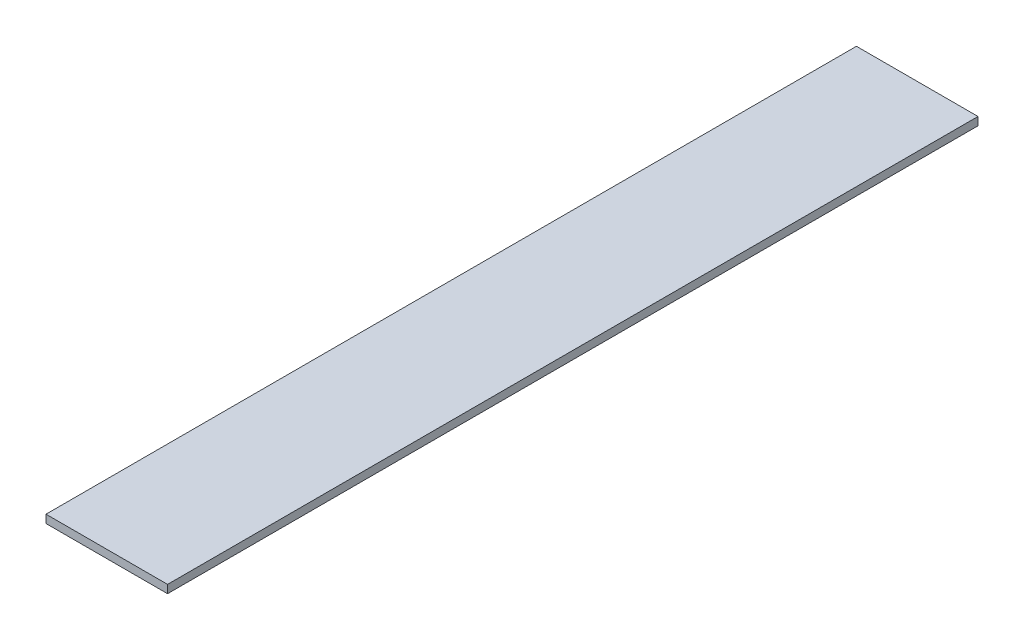
ISO-10303-21;
HEADER;
FILE_DESCRIPTION(('STEP AP214'),'2;1');
FILE_NAME('part.step','',(''),(''),'','','');
FILE_SCHEMA(('AUTOMOTIVE_DESIGN { 1 0 10303 214 1 1 1 1 }'));
ENDSEC;
DATA;
#1=APPLICATION_CONTEXT('core data for automotive mechanical design processes');
#2=APPLICATION_PROTOCOL_DEFINITION('international standard','automotive_design',2000,#1);
#3=PRODUCT_CONTEXT('',#1,'mechanical');
#4=PRODUCT('Part','Part','',(#3));
#5=PRODUCT_RELATED_PRODUCT_CATEGORY('part','',(#4));
#6=PRODUCT_DEFINITION_FORMATION('','',#4);
#7=PRODUCT_DEFINITION_CONTEXT('part definition',#1,'design');
#8=PRODUCT_DEFINITION('design','',#6,#7);
#9=PRODUCT_DEFINITION_SHAPE('','',#8);
#10=(LENGTH_UNIT() NAMED_UNIT(*) SI_UNIT(.MILLI.,.METRE.));
#11=(NAMED_UNIT(*) PLANE_ANGLE_UNIT() SI_UNIT($,.RADIAN.));
#12=(NAMED_UNIT(*) SI_UNIT($,.STERADIAN.) SOLID_ANGLE_UNIT());
#13=UNCERTAINTY_MEASURE_WITH_UNIT(LENGTH_MEASURE(1.E-05),#10,'distance_accuracy_value','');
#14=(GEOMETRIC_REPRESENTATION_CONTEXT(3) GLOBAL_UNCERTAINTY_ASSIGNED_CONTEXT((#13)) GLOBAL_UNIT_ASSIGNED_CONTEXT((#10,
#11,#12)) REPRESENTATION_CONTEXT('',''));
#15=CARTESIAN_POINT('',(0.,0.,0.));
#16=DIRECTION('',(0.,0.,1.));
#17=DIRECTION('',(1.,0.,0.));
#18=AXIS2_PLACEMENT_3D('',#15,#16,#17);
#19=CARTESIAN_POINT('',(-15.,-1.,200.));
#20=DIRECTION('',(1.,0.,0.));
#21=DIRECTION('',(0.,0.,-1.));
#22=AXIS2_PLACEMENT_3D('',#19,#20,#21);
#23=PLANE('',#22);
#24=DIRECTION('',(0.,-1.,0.));
#25=VECTOR('',#24,1.);
#26=CARTESIAN_POINT('',(-15.,-1.,0.));
#27=LINE('',#26,#25);
#28=CARTESIAN_POINT('',(-15.,0.999999999999999,0.));
#29=VERTEX_POINT('',#28);
#30=CARTESIAN_POINT('',(-15.,-1.,0.));
#31=VERTEX_POINT('',#30);
#32=EDGE_CURVE('E96',#29,#31,#27,.T.);
#33=ORIENTED_EDGE('',*,*,#32,.T.);
#34=DIRECTION('',(0.,0.,-1.));
#35=VECTOR('',#34,1.);
#36=CARTESIAN_POINT('',(-15.,-1.,200.));
#37=LINE('',#36,#35);
#38=CARTESIAN_POINT('',(-15.,-1.,200.));
#39=VERTEX_POINT('',#38);
#40=EDGE_CURVE('E11',#39,#31,#37,.T.);
#41=ORIENTED_EDGE('',*,*,#40,.F.);
#42=DIRECTION('',(0.,-1.,0.));
#43=VECTOR('',#42,1.);
#44=CARTESIAN_POINT('',(-15.,-1.,200.));
#45=LINE('',#44,#43);
#46=CARTESIAN_POINT('',(-15.,0.999999999999999,200.));
#47=VERTEX_POINT('',#46);
#48=EDGE_CURVE('E84',#47,#39,#45,.T.);
#49=ORIENTED_EDGE('',*,*,#48,.F.);
#50=DIRECTION('',(0.,0.,-1.));
#51=VECTOR('',#50,1.);
#52=CARTESIAN_POINT('',(-15.,0.999999999999999,200.));
#53=LINE('',#52,#51);
#54=EDGE_CURVE('E92',#47,#29,#53,.T.);
#55=ORIENTED_EDGE('',*,*,#54,.T.);
#56=EDGE_LOOP('',(#33,#41,#49,#55));
#57=FACE_BOUND('',#56,.T.);
#58=ADVANCED_FACE('F33',(#57),#23,.F.);
#59=CARTESIAN_POINT('',(15.,-0.999999999999997,200.));
#60=DIRECTION('',(0.,1.,0.));
#61=DIRECTION('',(-1.,0.,0.));
#62=AXIS2_PLACEMENT_3D('',#59,#60,#61);
#63=PLANE('',#62);
#64=DIRECTION('',(1.,0.,0.));
#65=VECTOR('',#64,1.);
#66=CARTESIAN_POINT('',(15.,-0.999999999999997,0.));
#67=LINE('',#66,#65);
#68=CARTESIAN_POINT('',(15.,-0.999999999999997,0.));
#69=VERTEX_POINT('',#68);
#70=EDGE_CURVE('E88',#31,#69,#67,.T.);
#71=ORIENTED_EDGE('',*,*,#70,.T.);
#72=DIRECTION('',(0.,0.,-1.));
#73=VECTOR('',#72,1.);
#74=CARTESIAN_POINT('',(15.,-0.999999999999997,200.));
#75=LINE('',#74,#73);
#76=CARTESIAN_POINT('',(15.,-0.999999999999997,200.));
#77=VERTEX_POINT('',#76);
#78=EDGE_CURVE('E41',#77,#69,#75,.T.);
#79=ORIENTED_EDGE('',*,*,#78,.F.);
#80=DIRECTION('',(1.,0.,0.));
#81=VECTOR('',#80,1.);
#82=CARTESIAN_POINT('',(15.,-0.999999999999997,200.));
#83=LINE('',#82,#81);
#84=EDGE_CURVE('E79',#39,#77,#83,.T.);
#85=ORIENTED_EDGE('',*,*,#84,.F.);
#86=ORIENTED_EDGE('',*,*,#40,.T.);
#87=EDGE_LOOP('',(#71,#79,#85,#86));
#88=FACE_BOUND('',#87,.T.);
#89=ADVANCED_FACE('F87',(#88),#63,.F.);
#90=CARTESIAN_POINT('',(15.,-0.999999999999997,200.));
#91=DIRECTION('',(-1.,0.,0.));
#92=DIRECTION('',(0.,0.,1.));
#93=AXIS2_PLACEMENT_3D('',#90,#91,#92);
#94=PLANE('',#93);
#95=DIRECTION('',(0.,1.,0.));
#96=VECTOR('',#95,1.);
#97=CARTESIAN_POINT('',(15.,-0.999999999999997,0.));
#98=LINE('',#97,#96);
#99=CARTESIAN_POINT('',(15.,1.,0.));
#100=VERTEX_POINT('',#99);
#101=EDGE_CURVE('E66',#69,#100,#98,.T.);
#102=ORIENTED_EDGE('',*,*,#101,.T.);
#103=DIRECTION('',(0.,0.,-1.));
#104=VECTOR('',#103,1.);
#105=CARTESIAN_POINT('',(15.,1.,200.));
#106=LINE('',#105,#104);
#107=CARTESIAN_POINT('',(15.,1.,200.));
#108=VERTEX_POINT('',#107);
#109=EDGE_CURVE('E89',#108,#100,#106,.T.);
#110=ORIENTED_EDGE('',*,*,#109,.F.);
#111=DIRECTION('',(0.,1.,0.));
#112=VECTOR('',#111,1.);
#113=CARTESIAN_POINT('',(15.,-0.999999999999997,200.));
#114=LINE('',#113,#112);
#115=EDGE_CURVE('E82',#77,#108,#114,.T.);
#116=ORIENTED_EDGE('',*,*,#115,.F.);
#117=ORIENTED_EDGE('',*,*,#78,.T.);
#118=EDGE_LOOP('',(#102,#110,#116,#117));
#119=FACE_BOUND('',#118,.T.);
#120=ADVANCED_FACE('F90',(#119),#94,.F.);
#121=CARTESIAN_POINT('',(15.,1.,200.));
#122=DIRECTION('',(0.,-1.,0.));
#123=DIRECTION('',(1.,0.,0.));
#124=AXIS2_PLACEMENT_3D('',#121,#122,#123);
#125=PLANE('',#124);
#126=DIRECTION('',(-1.,0.,0.));
#127=VECTOR('',#126,1.);
#128=CARTESIAN_POINT('',(15.,1.,0.));
#129=LINE('',#128,#127);
#130=EDGE_CURVE('E72',#100,#29,#129,.T.);
#131=ORIENTED_EDGE('',*,*,#130,.T.);
#132=ORIENTED_EDGE('',*,*,#54,.F.);
#133=DIRECTION('',(-1.,0.,0.));
#134=VECTOR('',#133,1.);
#135=CARTESIAN_POINT('',(15.,1.,200.));
#136=LINE('',#135,#134);
#137=EDGE_CURVE('E49',#108,#47,#136,.T.);
#138=ORIENTED_EDGE('',*,*,#137,.F.);
#139=ORIENTED_EDGE('',*,*,#109,.T.);
#140=EDGE_LOOP('',(#131,#132,#138,#139));
#141=FACE_BOUND('',#140,.T.);
#142=ADVANCED_FACE('F103',(#141),#125,.F.);
#143=CARTESIAN_POINT('',(0.,0.,200.));
#144=DIRECTION('',(0.,0.,1.));
#145=DIRECTION('',(1.,0.,0.));
#146=AXIS2_PLACEMENT_3D('',#143,#144,#145);
#147=PLANE('',#146);
#148=ORIENTED_EDGE('',*,*,#48,.T.);
#149=ORIENTED_EDGE('',*,*,#84,.T.);
#150=ORIENTED_EDGE('',*,*,#115,.T.);
#151=ORIENTED_EDGE('',*,*,#137,.T.);
#152=EDGE_LOOP('',(#148,#149,#150,#151));
#153=FACE_BOUND('',#152,.T.);
#154=ADVANCED_FACE('F80',(#153),#147,.T.);
#155=CARTESIAN_POINT('',(0.,0.,0.));
#156=DIRECTION('',(0.,0.,1.));
#157=DIRECTION('',(1.,0.,0.));
#158=AXIS2_PLACEMENT_3D('',#155,#156,#157);
#159=PLANE('',#158);
#160=ORIENTED_EDGE('',*,*,#32,.F.);
#161=ORIENTED_EDGE('',*,*,#130,.F.);
#162=ORIENTED_EDGE('',*,*,#101,.F.);
#163=ORIENTED_EDGE('',*,*,#70,.F.);
#164=EDGE_LOOP('',(#160,#161,#162,#163));
#165=FACE_BOUND('',#164,.T.);
#166=ADVANCED_FACE('F106',(#165),#159,.F.);
#167=CLOSED_SHELL('',(#58,#89,#120,#142,#154,#166));
#168=MANIFOLD_SOLID_BREP('B2',#167);
#169=ADVANCED_BREP_SHAPE_REPRESENTATION('',(#18,#168),#14);
#170=SHAPE_DEFINITION_REPRESENTATION(#9,#169);
ENDSEC;
END-ISO-10303-21;
